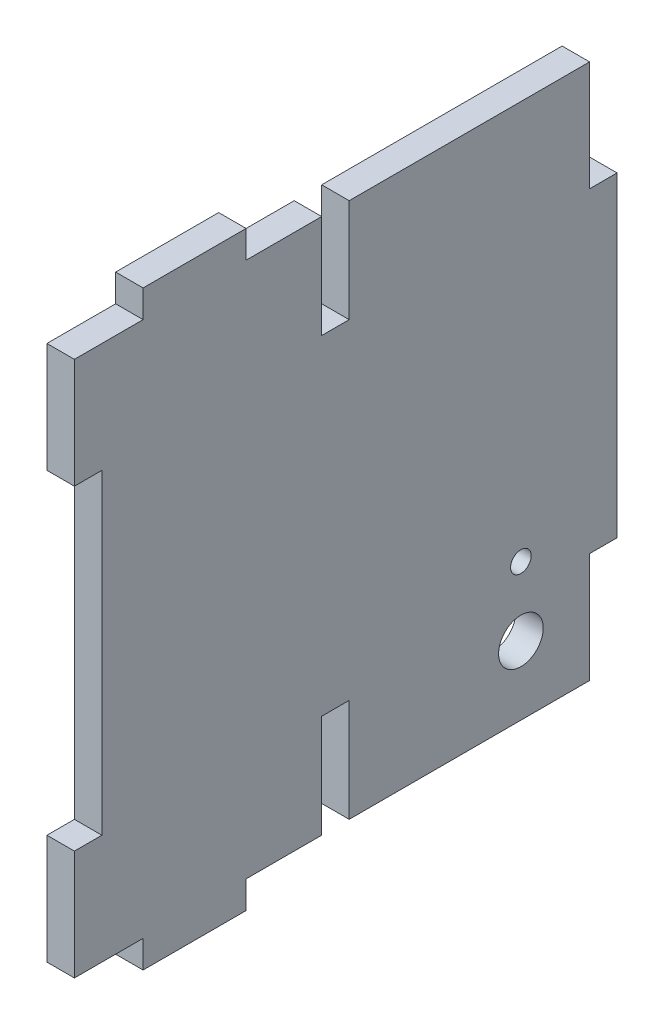
ISO-10303-21;
HEADER;
FILE_DESCRIPTION(('STEP AP214'),'2;1');
FILE_NAME('part.step','',(''),(''),'','','');
FILE_SCHEMA(('AUTOMOTIVE_DESIGN { 1 0 10303 214 1 1 1 1 }'));
ENDSEC;
DATA;
#1=APPLICATION_CONTEXT('core data for automotive mechanical design processes');
#2=APPLICATION_PROTOCOL_DEFINITION('international standard','automotive_design',2000,#1);
#3=PRODUCT_CONTEXT('',#1,'mechanical');
#4=PRODUCT('Part','Part','',(#3));
#5=PRODUCT_RELATED_PRODUCT_CATEGORY('part','',(#4));
#6=PRODUCT_DEFINITION_FORMATION('','',#4);
#7=PRODUCT_DEFINITION_CONTEXT('part definition',#1,'design');
#8=PRODUCT_DEFINITION('design','',#6,#7);
#9=PRODUCT_DEFINITION_SHAPE('','',#8);
#10=(LENGTH_UNIT() NAMED_UNIT(*) SI_UNIT(.MILLI.,.METRE.));
#11=(NAMED_UNIT(*) PLANE_ANGLE_UNIT() SI_UNIT($,.RADIAN.));
#12=(NAMED_UNIT(*) SI_UNIT($,.STERADIAN.) SOLID_ANGLE_UNIT());
#13=UNCERTAINTY_MEASURE_WITH_UNIT(LENGTH_MEASURE(1.E-05),#10,'distance_accuracy_value','');
#14=(GEOMETRIC_REPRESENTATION_CONTEXT(3) GLOBAL_UNCERTAINTY_ASSIGNED_CONTEXT((#13)) GLOBAL_UNIT_ASSIGNED_CONTEXT((#10,
#11,#12)) REPRESENTATION_CONTEXT('',''));
#15=CARTESIAN_POINT('',(0.,0.,0.));
#16=DIRECTION('',(0.,0.,1.));
#17=DIRECTION('',(1.,0.,0.));
#18=AXIS2_PLACEMENT_3D('',#15,#16,#17);
#19=CARTESIAN_POINT('',(4.,0.,0.));
#20=DIRECTION('',(0.,0.,-1.));
#21=DIRECTION('',(-1.,0.,0.));
#22=AXIS2_PLACEMENT_3D('',#19,#20,#21);
#23=PLANE('',#22);
#24=DIRECTION('',(0.,-1.,0.));
#25=VECTOR('',#24,1.);
#26=CARTESIAN_POINT('',(0.,0.,0.));
#27=LINE('',#26,#25);
#28=CARTESIAN_POINT('',(0.,16.,0.));
#29=VERTEX_POINT('',#28);
#30=CARTESIAN_POINT('',(0.,0.,0.));
#31=VERTEX_POINT('',#30);
#32=EDGE_CURVE('E250',#29,#31,#27,.T.);
#33=ORIENTED_EDGE('',*,*,#32,.T.);
#34=DIRECTION('',(-1.,0.,0.));
#35=VECTOR('',#34,1.);
#36=CARTESIAN_POINT('',(4.,0.,0.));
#37=LINE('',#36,#35);
#38=CARTESIAN_POINT('',(4.,0.,0.));
#39=VERTEX_POINT('',#38);
#40=EDGE_CURVE('E11',#39,#31,#37,.T.);
#41=ORIENTED_EDGE('',*,*,#40,.F.);
#42=DIRECTION('',(0.,-1.,0.));
#43=VECTOR('',#42,1.);
#44=CARTESIAN_POINT('',(4.,0.,0.));
#45=LINE('',#44,#43);
#46=CARTESIAN_POINT('',(4.,16.,0.));
#47=VERTEX_POINT('',#46);
#48=EDGE_CURVE('E305',#47,#39,#45,.T.);
#49=ORIENTED_EDGE('',*,*,#48,.F.);
#50=DIRECTION('',(-1.,0.,0.));
#51=VECTOR('',#50,1.);
#52=CARTESIAN_POINT('',(4.,16.,0.));
#53=LINE('',#52,#51);
#54=EDGE_CURVE('E246',#47,#29,#53,.T.);
#55=ORIENTED_EDGE('',*,*,#54,.T.);
#56=EDGE_LOOP('',(#33,#41,#49,#55));
#57=FACE_BOUND('',#56,.T.);
#58=ADVANCED_FACE('F34',(#57),#23,.F.);
#59=CARTESIAN_POINT('',(4.,0.,0.));
#60=DIRECTION('',(0.,1.,0.));
#61=DIRECTION('',(0.,0.,1.));
#62=AXIS2_PLACEMENT_3D('',#59,#60,#61);
#63=PLANE('',#62);
#64=DIRECTION('',(0.,0.,-1.));
#65=VECTOR('',#64,1.);
#66=CARTESIAN_POINT('',(0.,0.,0.));
#67=LINE('',#66,#65);
#68=CARTESIAN_POINT('',(0.,0.,-10.));
#69=VERTEX_POINT('',#68);
#70=EDGE_CURVE('E253',#31,#69,#67,.T.);
#71=ORIENTED_EDGE('',*,*,#70,.T.);
#72=DIRECTION('',(-1.,0.,0.));
#73=VECTOR('',#72,1.);
#74=CARTESIAN_POINT('',(4.,0.,-10.));
#75=LINE('',#74,#73);
#76=CARTESIAN_POINT('',(4.,0.,-10.));
#77=VERTEX_POINT('',#76);
#78=EDGE_CURVE('E42',#77,#69,#75,.T.);
#79=ORIENTED_EDGE('',*,*,#78,.F.);
#80=DIRECTION('',(0.,0.,-1.));
#81=VECTOR('',#80,1.);
#82=CARTESIAN_POINT('',(4.,0.,0.));
#83=LINE('',#82,#81);
#84=EDGE_CURVE('E153',#39,#77,#83,.T.);
#85=ORIENTED_EDGE('',*,*,#84,.F.);
#86=ORIENTED_EDGE('',*,*,#40,.T.);
#87=EDGE_LOOP('',(#71,#79,#85,#86));
#88=FACE_BOUND('',#87,.T.);
#89=ADVANCED_FACE('F464',(#88),#63,.F.);
#90=CARTESIAN_POINT('',(4.,0.,-10.));
#91=DIRECTION('',(0.,0.,-1.));
#92=DIRECTION('',(0.,1.,0.));
#93=AXIS2_PLACEMENT_3D('',#90,#91,#92);
#94=PLANE('',#93);
#95=DIRECTION('',(0.,-1.,0.));
#96=VECTOR('',#95,1.);
#97=CARTESIAN_POINT('',(0.,0.,-10.));
#98=LINE('',#97,#96);
#99=CARTESIAN_POINT('',(0.,-4.,-10.));
#100=VERTEX_POINT('',#99);
#101=EDGE_CURVE('E256',#69,#100,#98,.T.);
#102=ORIENTED_EDGE('',*,*,#101,.T.);
#103=DIRECTION('',(-1.,0.,0.));
#104=VECTOR('',#103,1.);
#105=CARTESIAN_POINT('',(4.,-4.,-10.));
#106=LINE('',#105,#104);
#107=CARTESIAN_POINT('',(4.,-4.,-10.));
#108=VERTEX_POINT('',#107);
#109=EDGE_CURVE('E372',#108,#100,#106,.T.);
#110=ORIENTED_EDGE('',*,*,#109,.F.);
#111=DIRECTION('',(0.,-1.,0.));
#112=VECTOR('',#111,1.);
#113=CARTESIAN_POINT('',(4.,0.,-10.));
#114=LINE('',#113,#112);
#115=EDGE_CURVE('E380',#77,#108,#114,.T.);
#116=ORIENTED_EDGE('',*,*,#115,.F.);
#117=ORIENTED_EDGE('',*,*,#78,.T.);
#118=EDGE_LOOP('',(#102,#110,#116,#117));
#119=FACE_BOUND('',#118,.T.);
#120=ADVANCED_FACE('F378',(#119),#94,.F.);
#121=CARTESIAN_POINT('',(4.,-4.,-10.));
#122=DIRECTION('',(0.,1.,0.));
#123=DIRECTION('',(0.,0.,1.));
#124=AXIS2_PLACEMENT_3D('',#121,#122,#123);
#125=PLANE('',#124);
#126=DIRECTION('',(0.,0.,-1.));
#127=VECTOR('',#126,1.);
#128=CARTESIAN_POINT('',(0.,-4.,-10.));
#129=LINE('',#128,#127);
#130=CARTESIAN_POINT('',(0.,-4.,-25.));
#131=VERTEX_POINT('',#130);
#132=EDGE_CURVE('E258',#100,#131,#129,.T.);
#133=ORIENTED_EDGE('',*,*,#132,.T.);
#134=DIRECTION('',(-1.,0.,0.));
#135=VECTOR('',#134,1.);
#136=CARTESIAN_POINT('',(4.,-4.,-25.));
#137=LINE('',#136,#135);
#138=CARTESIAN_POINT('',(4.,-4.,-25.));
#139=VERTEX_POINT('',#138);
#140=EDGE_CURVE('E369',#139,#131,#137,.T.);
#141=ORIENTED_EDGE('',*,*,#140,.F.);
#142=DIRECTION('',(0.,0.,-1.));
#143=VECTOR('',#142,1.);
#144=CARTESIAN_POINT('',(4.,-4.,-10.));
#145=LINE('',#144,#143);
#146=EDGE_CURVE('E398',#108,#139,#145,.T.);
#147=ORIENTED_EDGE('',*,*,#146,.F.);
#148=ORIENTED_EDGE('',*,*,#109,.T.);
#149=EDGE_LOOP('',(#133,#141,#147,#148));
#150=FACE_BOUND('',#149,.T.);
#151=ADVANCED_FACE('F389',(#150),#125,.F.);
#152=CARTESIAN_POINT('',(4.,-4.,-25.));
#153=DIRECTION('',(0.,0.,1.));
#154=DIRECTION('',(0.,-1.,0.));
#155=AXIS2_PLACEMENT_3D('',#152,#153,#154);
#156=PLANE('',#155);
#157=DIRECTION('',(0.,1.,0.));
#158=VECTOR('',#157,1.);
#159=CARTESIAN_POINT('',(0.,-4.,-25.));
#160=LINE('',#159,#158);
#161=CARTESIAN_POINT('',(0.,0.,-25.));
#162=VERTEX_POINT('',#161);
#163=EDGE_CURVE('E260',#131,#162,#160,.T.);
#164=ORIENTED_EDGE('',*,*,#163,.T.);
#165=DIRECTION('',(-1.,0.,0.));
#166=VECTOR('',#165,1.);
#167=CARTESIAN_POINT('',(4.,0.,-25.));
#168=LINE('',#167,#166);
#169=CARTESIAN_POINT('',(4.,0.,-25.));
#170=VERTEX_POINT('',#169);
#171=EDGE_CURVE('E366',#170,#162,#168,.T.);
#172=ORIENTED_EDGE('',*,*,#171,.F.);
#173=DIRECTION('',(0.,1.,0.));
#174=VECTOR('',#173,1.);
#175=CARTESIAN_POINT('',(4.,-4.,-25.));
#176=LINE('',#175,#174);
#177=EDGE_CURVE('E395',#139,#170,#176,.T.);
#178=ORIENTED_EDGE('',*,*,#177,.F.);
#179=ORIENTED_EDGE('',*,*,#140,.T.);
#180=EDGE_LOOP('',(#164,#172,#178,#179));
#181=FACE_BOUND('',#180,.T.);
#182=ADVANCED_FACE('F393',(#181),#156,.F.);
#183=CARTESIAN_POINT('',(4.,0.,-25.));
#184=DIRECTION('',(0.,1.,0.));
#185=DIRECTION('',(0.,0.,1.));
#186=AXIS2_PLACEMENT_3D('',#183,#184,#185);
#187=PLANE('',#186);
#188=DIRECTION('',(0.,0.,-1.));
#189=VECTOR('',#188,1.);
#190=CARTESIAN_POINT('',(0.,0.,-25.));
#191=LINE('',#190,#189);
#192=CARTESIAN_POINT('',(0.,0.,-36.));
#193=VERTEX_POINT('',#192);
#194=EDGE_CURVE('E262',#162,#193,#191,.T.);
#195=ORIENTED_EDGE('',*,*,#194,.T.);
#196=DIRECTION('',(-1.,0.,0.));
#197=VECTOR('',#196,1.);
#198=CARTESIAN_POINT('',(4.,0.,-36.));
#199=LINE('',#198,#197);
#200=CARTESIAN_POINT('',(4.,0.,-36.));
#201=VERTEX_POINT('',#200);
#202=EDGE_CURVE('E363',#201,#193,#199,.T.);
#203=ORIENTED_EDGE('',*,*,#202,.F.);
#204=DIRECTION('',(0.,0.,-1.));
#205=VECTOR('',#204,1.);
#206=CARTESIAN_POINT('',(4.,0.,-25.));
#207=LINE('',#206,#205);
#208=EDGE_CURVE('E397',#170,#201,#207,.T.);
#209=ORIENTED_EDGE('',*,*,#208,.F.);
#210=ORIENTED_EDGE('',*,*,#171,.T.);
#211=EDGE_LOOP('',(#195,#203,#209,#210));
#212=FACE_BOUND('',#211,.T.);
#213=ADVANCED_FACE('F477',(#212),#187,.F.);
#214=CARTESIAN_POINT('',(4.,0.,-36.));
#215=DIRECTION('',(0.,0.,1.));
#216=DIRECTION('',(1.,0.,0.));
#217=AXIS2_PLACEMENT_3D('',#214,#215,#216);
#218=PLANE('',#217);
#219=DIRECTION('',(0.,1.,0.));
#220=VECTOR('',#219,1.);
#221=CARTESIAN_POINT('',(0.,0.,-36.));
#222=LINE('',#221,#220);
#223=CARTESIAN_POINT('',(0.,15.,-36.));
#224=VERTEX_POINT('',#223);
#225=EDGE_CURVE('E264',#193,#224,#222,.T.);
#226=ORIENTED_EDGE('',*,*,#225,.T.);
#227=DIRECTION('',(-1.,0.,0.));
#228=VECTOR('',#227,1.);
#229=CARTESIAN_POINT('',(4.,15.,-36.));
#230=LINE('',#229,#228);
#231=CARTESIAN_POINT('',(4.,15.,-36.));
#232=VERTEX_POINT('',#231);
#233=EDGE_CURVE('E360',#232,#224,#230,.T.);
#234=ORIENTED_EDGE('',*,*,#233,.F.);
#235=DIRECTION('',(0.,1.,0.));
#236=VECTOR('',#235,1.);
#237=CARTESIAN_POINT('',(4.,0.,-36.));
#238=LINE('',#237,#236);
#239=EDGE_CURVE('E400',#201,#232,#238,.T.);
#240=ORIENTED_EDGE('',*,*,#239,.F.);
#241=ORIENTED_EDGE('',*,*,#202,.T.);
#242=EDGE_LOOP('',(#226,#234,#240,#241));
#243=FACE_BOUND('',#242,.T.);
#244=ADVANCED_FACE('F480',(#243),#218,.F.);
#245=CARTESIAN_POINT('',(4.,15.,-36.));
#246=DIRECTION('',(0.,1.,0.));
#247=DIRECTION('',(0.,0.,1.));
#248=AXIS2_PLACEMENT_3D('',#245,#246,#247);
#249=PLANE('',#248);
#250=DIRECTION('',(0.,0.,-1.));
#251=VECTOR('',#250,1.);
#252=CARTESIAN_POINT('',(0.,15.,-36.));
#253=LINE('',#252,#251);
#254=CARTESIAN_POINT('',(0.,15.,-40.));
#255=VERTEX_POINT('',#254);
#256=EDGE_CURVE('E266',#224,#255,#253,.T.);
#257=ORIENTED_EDGE('',*,*,#256,.T.);
#258=DIRECTION('',(-1.,0.,0.));
#259=VECTOR('',#258,1.);
#260=CARTESIAN_POINT('',(4.,15.,-40.));
#261=LINE('',#260,#259);
#262=CARTESIAN_POINT('',(4.,15.,-40.));
#263=VERTEX_POINT('',#262);
#264=EDGE_CURVE('E357',#263,#255,#261,.T.);
#265=ORIENTED_EDGE('',*,*,#264,.F.);
#266=DIRECTION('',(0.,0.,-1.));
#267=VECTOR('',#266,1.);
#268=CARTESIAN_POINT('',(4.,15.,-36.));
#269=LINE('',#268,#267);
#270=EDGE_CURVE('E406',#232,#263,#269,.T.);
#271=ORIENTED_EDGE('',*,*,#270,.F.);
#272=ORIENTED_EDGE('',*,*,#233,.T.);
#273=EDGE_LOOP('',(#257,#265,#271,#272));
#274=FACE_BOUND('',#273,.T.);
#275=ADVANCED_FACE('F484',(#274),#249,.F.);
#276=CARTESIAN_POINT('',(4.,0.,-40.));
#277=DIRECTION('',(0.,0.,-1.));
#278=DIRECTION('',(-1.,0.,0.));
#279=AXIS2_PLACEMENT_3D('',#276,#277,#278);
#280=PLANE('',#279);
#281=DIRECTION('',(0.,-1.,0.));
#282=VECTOR('',#281,1.);
#283=CARTESIAN_POINT('',(0.,0.,-40.));
#284=LINE('',#283,#282);
#285=CARTESIAN_POINT('',(0.,0.,-40.));
#286=VERTEX_POINT('',#285);
#287=EDGE_CURVE('E268',#255,#286,#284,.T.);
#288=ORIENTED_EDGE('',*,*,#287,.T.);
#289=DIRECTION('',(-1.,0.,0.));
#290=VECTOR('',#289,1.);
#291=CARTESIAN_POINT('',(4.,0.,-40.));
#292=LINE('',#291,#290);
#293=CARTESIAN_POINT('',(4.,0.,-40.));
#294=VERTEX_POINT('',#293);
#295=EDGE_CURVE('E354',#294,#286,#292,.T.);
#296=ORIENTED_EDGE('',*,*,#295,.F.);
#297=DIRECTION('',(0.,-1.,0.));
#298=VECTOR('',#297,1.);
#299=CARTESIAN_POINT('',(4.,0.,-40.));
#300=LINE('',#299,#298);
#301=EDGE_CURVE('E408',#263,#294,#300,.T.);
#302=ORIENTED_EDGE('',*,*,#301,.F.);
#303=ORIENTED_EDGE('',*,*,#264,.T.);
#304=EDGE_LOOP('',(#288,#296,#302,#303));
#305=FACE_BOUND('',#304,.T.);
#306=ADVANCED_FACE('F488',(#305),#280,.F.);
#307=CARTESIAN_POINT('',(4.,0.,-40.));
#308=DIRECTION('',(0.,1.,0.));
#309=DIRECTION('',(0.,0.,1.));
#310=AXIS2_PLACEMENT_3D('',#307,#308,#309);
#311=PLANE('',#310);
#312=DIRECTION('',(0.,0.,-1.));
#313=VECTOR('',#312,1.);
#314=CARTESIAN_POINT('',(0.,0.,-40.));
#315=LINE('',#314,#313);
#316=CARTESIAN_POINT('',(0.,0.,-75.));
#317=VERTEX_POINT('',#316);
#318=EDGE_CURVE('E270',#286,#317,#315,.T.);
#319=ORIENTED_EDGE('',*,*,#318,.T.);
#320=DIRECTION('',(-1.,0.,0.));
#321=VECTOR('',#320,1.);
#322=CARTESIAN_POINT('',(4.,0.,-75.));
#323=LINE('',#322,#321);
#324=CARTESIAN_POINT('',(4.,0.,-75.));
#325=VERTEX_POINT('',#324);
#326=EDGE_CURVE('E351',#325,#317,#323,.T.);
#327=ORIENTED_EDGE('',*,*,#326,.F.);
#328=DIRECTION('',(0.,0.,-1.));
#329=VECTOR('',#328,1.);
#330=CARTESIAN_POINT('',(4.,0.,-40.));
#331=LINE('',#330,#329);
#332=EDGE_CURVE('E410',#294,#325,#331,.T.);
#333=ORIENTED_EDGE('',*,*,#332,.F.);
#334=ORIENTED_EDGE('',*,*,#295,.T.);
#335=EDGE_LOOP('',(#319,#327,#333,#334));
#336=FACE_BOUND('',#335,.T.);
#337=ADVANCED_FACE('F492',(#336),#311,.F.);
#338=CARTESIAN_POINT('',(4.,0.,-75.));
#339=DIRECTION('',(0.,0.,1.));
#340=DIRECTION('',(1.,0.,0.));
#341=AXIS2_PLACEMENT_3D('',#338,#339,#340);
#342=PLANE('',#341);
#343=DIRECTION('',(0.,1.,0.));
#344=VECTOR('',#343,1.);
#345=CARTESIAN_POINT('',(0.,0.,-75.));
#346=LINE('',#345,#344);
#347=CARTESIAN_POINT('',(0.,16.,-75.));
#348=VERTEX_POINT('',#347);
#349=EDGE_CURVE('E272',#317,#348,#346,.T.);
#350=ORIENTED_EDGE('',*,*,#349,.T.);
#351=DIRECTION('',(-1.,0.,0.));
#352=VECTOR('',#351,1.);
#353=CARTESIAN_POINT('',(4.,16.,-75.));
#354=LINE('',#353,#352);
#355=CARTESIAN_POINT('',(4.,16.,-75.));
#356=VERTEX_POINT('',#355);
#357=EDGE_CURVE('E348',#356,#348,#354,.T.);
#358=ORIENTED_EDGE('',*,*,#357,.F.);
#359=DIRECTION('',(0.,1.,0.));
#360=VECTOR('',#359,1.);
#361=CARTESIAN_POINT('',(4.,0.,-75.));
#362=LINE('',#361,#360);
#363=EDGE_CURVE('E412',#325,#356,#362,.T.);
#364=ORIENTED_EDGE('',*,*,#363,.F.);
#365=ORIENTED_EDGE('',*,*,#326,.T.);
#366=EDGE_LOOP('',(#350,#358,#364,#365));
#367=FACE_BOUND('',#366,.T.);
#368=ADVANCED_FACE('F496',(#367),#342,.F.);
#369=CARTESIAN_POINT('',(4.,16.,-75.));
#370=DIRECTION('',(0.,1.,0.));
#371=DIRECTION('',(0.,0.,1.));
#372=AXIS2_PLACEMENT_3D('',#369,#370,#371);
#373=PLANE('',#372);
#374=DIRECTION('',(0.,0.,-1.));
#375=VECTOR('',#374,1.);
#376=CARTESIAN_POINT('',(0.,16.,-75.));
#377=LINE('',#376,#375);
#378=CARTESIAN_POINT('',(0.,16.,-79.));
#379=VERTEX_POINT('',#378);
#380=EDGE_CURVE('E274',#348,#379,#377,.T.);
#381=ORIENTED_EDGE('',*,*,#380,.T.);
#382=DIRECTION('',(-1.,0.,0.));
#383=VECTOR('',#382,1.);
#384=CARTESIAN_POINT('',(4.,16.,-79.));
#385=LINE('',#384,#383);
#386=CARTESIAN_POINT('',(4.,16.,-79.));
#387=VERTEX_POINT('',#386);
#388=EDGE_CURVE('E345',#387,#379,#385,.T.);
#389=ORIENTED_EDGE('',*,*,#388,.F.);
#390=DIRECTION('',(0.,0.,-1.));
#391=VECTOR('',#390,1.);
#392=CARTESIAN_POINT('',(4.,16.,-75.));
#393=LINE('',#392,#391);
#394=EDGE_CURVE('E414',#356,#387,#393,.T.);
#395=ORIENTED_EDGE('',*,*,#394,.F.);
#396=ORIENTED_EDGE('',*,*,#357,.T.);
#397=EDGE_LOOP('',(#381,#389,#395,#396));
#398=FACE_BOUND('',#397,.T.);
#399=ADVANCED_FACE('F500',(#398),#373,.F.);
#400=CARTESIAN_POINT('',(4.,62.,-79.));
#401=DIRECTION('',(0.,0.,1.));
#402=DIRECTION('',(0.,-1.,0.));
#403=AXIS2_PLACEMENT_3D('',#400,#401,#402);
#404=PLANE('',#403);
#405=DIRECTION('',(0.,1.,0.));
#406=VECTOR('',#405,1.);
#407=CARTESIAN_POINT('',(0.,62.,-79.));
#408=LINE('',#407,#406);
#409=CARTESIAN_POINT('',(0.,62.,-79.));
#410=VERTEX_POINT('',#409);
#411=EDGE_CURVE('E276',#379,#410,#408,.T.);
#412=ORIENTED_EDGE('',*,*,#411,.T.);
#413=DIRECTION('',(-1.,0.,0.));
#414=VECTOR('',#413,1.);
#415=CARTESIAN_POINT('',(4.,62.,-79.));
#416=LINE('',#415,#414);
#417=CARTESIAN_POINT('',(4.,62.,-79.));
#418=VERTEX_POINT('',#417);
#419=EDGE_CURVE('E342',#418,#410,#416,.T.);
#420=ORIENTED_EDGE('',*,*,#419,.F.);
#421=DIRECTION('',(0.,1.,0.));
#422=VECTOR('',#421,1.);
#423=CARTESIAN_POINT('',(4.,62.,-79.));
#424=LINE('',#423,#422);
#425=EDGE_CURVE('E416',#387,#418,#424,.T.);
#426=ORIENTED_EDGE('',*,*,#425,.F.);
#427=ORIENTED_EDGE('',*,*,#388,.T.);
#428=EDGE_LOOP('',(#412,#420,#426,#427));
#429=FACE_BOUND('',#428,.T.);
#430=ADVANCED_FACE('F504',(#429),#404,.F.);
#431=CARTESIAN_POINT('',(4.,62.,-75.));
#432=DIRECTION('',(0.,-1.,0.));
#433=DIRECTION('',(0.,0.,-1.));
#434=AXIS2_PLACEMENT_3D('',#431,#432,#433);
#435=PLANE('',#434);
#436=DIRECTION('',(0.,0.,1.));
#437=VECTOR('',#436,1.);
#438=CARTESIAN_POINT('',(0.,62.,-75.));
#439=LINE('',#438,#437);
#440=CARTESIAN_POINT('',(0.,62.,-75.));
#441=VERTEX_POINT('',#440);
#442=EDGE_CURVE('E278',#410,#441,#439,.T.);
#443=ORIENTED_EDGE('',*,*,#442,.T.);
#444=DIRECTION('',(-1.,0.,0.));
#445=VECTOR('',#444,1.);
#446=CARTESIAN_POINT('',(4.,62.,-75.));
#447=LINE('',#446,#445);
#448=CARTESIAN_POINT('',(4.,62.,-75.));
#449=VERTEX_POINT('',#448);
#450=EDGE_CURVE('E339',#449,#441,#447,.T.);
#451=ORIENTED_EDGE('',*,*,#450,.F.);
#452=DIRECTION('',(0.,0.,1.));
#453=VECTOR('',#452,1.);
#454=CARTESIAN_POINT('',(4.,62.,-75.));
#455=LINE('',#454,#453);
#456=EDGE_CURVE('E418',#418,#449,#455,.T.);
#457=ORIENTED_EDGE('',*,*,#456,.F.);
#458=ORIENTED_EDGE('',*,*,#419,.T.);
#459=EDGE_LOOP('',(#443,#451,#457,#458));
#460=FACE_BOUND('',#459,.T.);
#461=ADVANCED_FACE('F508',(#460),#435,.F.);
#462=CARTESIAN_POINT('',(4.,62.,-75.));
#463=DIRECTION('',(0.,0.,1.));
#464=DIRECTION('',(0.,-1.,0.));
#465=AXIS2_PLACEMENT_3D('',#462,#463,#464);
#466=PLANE('',#465);
#467=DIRECTION('',(0.,1.,0.));
#468=VECTOR('',#467,1.);
#469=CARTESIAN_POINT('',(0.,62.,-75.));
#470=LINE('',#469,#468);
#471=CARTESIAN_POINT('',(0.,78.,-75.));
#472=VERTEX_POINT('',#471);
#473=EDGE_CURVE('E280',#441,#472,#470,.T.);
#474=ORIENTED_EDGE('',*,*,#473,.T.);
#475=DIRECTION('',(-1.,0.,0.));
#476=VECTOR('',#475,1.);
#477=CARTESIAN_POINT('',(4.,78.,-75.));
#478=LINE('',#477,#476);
#479=CARTESIAN_POINT('',(4.,78.,-75.));
#480=VERTEX_POINT('',#479);
#481=EDGE_CURVE('E336',#480,#472,#478,.T.);
#482=ORIENTED_EDGE('',*,*,#481,.F.);
#483=DIRECTION('',(0.,1.,0.));
#484=VECTOR('',#483,1.);
#485=CARTESIAN_POINT('',(4.,62.,-75.));
#486=LINE('',#485,#484);
#487=EDGE_CURVE('E420',#449,#480,#486,.T.);
#488=ORIENTED_EDGE('',*,*,#487,.F.);
#489=ORIENTED_EDGE('',*,*,#450,.T.);
#490=EDGE_LOOP('',(#474,#482,#488,#489));
#491=FACE_BOUND('',#490,.T.);
#492=ADVANCED_FACE('F512',(#491),#466,.F.);
#493=CARTESIAN_POINT('',(4.,78.,-40.));
#494=DIRECTION('',(0.,-1.,0.));
#495=DIRECTION('',(0.,0.,-1.));
#496=AXIS2_PLACEMENT_3D('',#493,#494,#495);
#497=PLANE('',#496);
#498=DIRECTION('',(0.,0.,1.));
#499=VECTOR('',#498,1.);
#500=CARTESIAN_POINT('',(0.,78.,-40.));
#501=LINE('',#500,#499);
#502=CARTESIAN_POINT('',(0.,78.,-40.));
#503=VERTEX_POINT('',#502);
#504=EDGE_CURVE('E282',#472,#503,#501,.T.);
#505=ORIENTED_EDGE('',*,*,#504,.T.);
#506=DIRECTION('',(-1.,0.,0.));
#507=VECTOR('',#506,1.);
#508=CARTESIAN_POINT('',(4.,78.,-40.));
#509=LINE('',#508,#507);
#510=CARTESIAN_POINT('',(4.,78.,-40.));
#511=VERTEX_POINT('',#510);
#512=EDGE_CURVE('E333',#511,#503,#509,.T.);
#513=ORIENTED_EDGE('',*,*,#512,.F.);
#514=DIRECTION('',(0.,0.,1.));
#515=VECTOR('',#514,1.);
#516=CARTESIAN_POINT('',(4.,78.,-40.));
#517=LINE('',#516,#515);
#518=EDGE_CURVE('E422',#480,#511,#517,.T.);
#519=ORIENTED_EDGE('',*,*,#518,.F.);
#520=ORIENTED_EDGE('',*,*,#481,.T.);
#521=EDGE_LOOP('',(#505,#513,#519,#520));
#522=FACE_BOUND('',#521,.T.);
#523=ADVANCED_FACE('F516',(#522),#497,.F.);
#524=CARTESIAN_POINT('',(4.,78.,-40.));
#525=DIRECTION('',(0.,0.,-1.));
#526=DIRECTION('',(0.,1.,0.));
#527=AXIS2_PLACEMENT_3D('',#524,#525,#526);
#528=PLANE('',#527);
#529=DIRECTION('',(0.,-1.,0.));
#530=VECTOR('',#529,1.);
#531=CARTESIAN_POINT('',(0.,78.,-40.));
#532=LINE('',#531,#530);
#533=CARTESIAN_POINT('',(0.,63.,-40.));
#534=VERTEX_POINT('',#533);
#535=EDGE_CURVE('E284',#503,#534,#532,.T.);
#536=ORIENTED_EDGE('',*,*,#535,.T.);
#537=DIRECTION('',(-1.,0.,0.));
#538=VECTOR('',#537,1.);
#539=CARTESIAN_POINT('',(4.,63.,-40.));
#540=LINE('',#539,#538);
#541=CARTESIAN_POINT('',(4.,63.,-40.));
#542=VERTEX_POINT('',#541);
#543=EDGE_CURVE('E330',#542,#534,#540,.T.);
#544=ORIENTED_EDGE('',*,*,#543,.F.);
#545=DIRECTION('',(0.,-1.,0.));
#546=VECTOR('',#545,1.);
#547=CARTESIAN_POINT('',(4.,78.,-40.));
#548=LINE('',#547,#546);
#549=EDGE_CURVE('E424',#511,#542,#548,.T.);
#550=ORIENTED_EDGE('',*,*,#549,.F.);
#551=ORIENTED_EDGE('',*,*,#512,.T.);
#552=EDGE_LOOP('',(#536,#544,#550,#551));
#553=FACE_BOUND('',#552,.T.);
#554=ADVANCED_FACE('F520',(#553),#528,.F.);
#555=CARTESIAN_POINT('',(4.,63.,-36.));
#556=DIRECTION('',(0.,-1.,0.));
#557=DIRECTION('',(0.,0.,-1.));
#558=AXIS2_PLACEMENT_3D('',#555,#556,#557);
#559=PLANE('',#558);
#560=DIRECTION('',(0.,0.,1.));
#561=VECTOR('',#560,1.);
#562=CARTESIAN_POINT('',(0.,63.,-36.));
#563=LINE('',#562,#561);
#564=CARTESIAN_POINT('',(0.,63.,-36.));
#565=VERTEX_POINT('',#564);
#566=EDGE_CURVE('E286',#534,#565,#563,.T.);
#567=ORIENTED_EDGE('',*,*,#566,.T.);
#568=DIRECTION('',(-1.,0.,0.));
#569=VECTOR('',#568,1.);
#570=CARTESIAN_POINT('',(4.,63.,-36.));
#571=LINE('',#570,#569);
#572=CARTESIAN_POINT('',(4.,63.,-36.));
#573=VERTEX_POINT('',#572);
#574=EDGE_CURVE('E327',#573,#565,#571,.T.);
#575=ORIENTED_EDGE('',*,*,#574,.F.);
#576=DIRECTION('',(0.,0.,1.));
#577=VECTOR('',#576,1.);
#578=CARTESIAN_POINT('',(4.,63.,-36.));
#579=LINE('',#578,#577);
#580=EDGE_CURVE('E426',#542,#573,#579,.T.);
#581=ORIENTED_EDGE('',*,*,#580,.F.);
#582=ORIENTED_EDGE('',*,*,#543,.T.);
#583=EDGE_LOOP('',(#567,#575,#581,#582));
#584=FACE_BOUND('',#583,.T.);
#585=ADVANCED_FACE('F524',(#584),#559,.F.);
#586=CARTESIAN_POINT('',(4.,78.,-36.));
#587=DIRECTION('',(0.,0.,1.));
#588=DIRECTION('',(1.,0.,0.));
#589=AXIS2_PLACEMENT_3D('',#586,#587,#588);
#590=PLANE('',#589);
#591=DIRECTION('',(0.,1.,0.));
#592=VECTOR('',#591,1.);
#593=CARTESIAN_POINT('',(0.,78.,-36.));
#594=LINE('',#593,#592);
#595=CARTESIAN_POINT('',(0.,78.,-36.));
#596=VERTEX_POINT('',#595);
#597=EDGE_CURVE('E288',#565,#596,#594,.T.);
#598=ORIENTED_EDGE('',*,*,#597,.T.);
#599=DIRECTION('',(-1.,0.,0.));
#600=VECTOR('',#599,1.);
#601=CARTESIAN_POINT('',(4.,78.,-36.));
#602=LINE('',#601,#600);
#603=CARTESIAN_POINT('',(4.,78.,-36.));
#604=VERTEX_POINT('',#603);
#605=EDGE_CURVE('E324',#604,#596,#602,.T.);
#606=ORIENTED_EDGE('',*,*,#605,.F.);
#607=DIRECTION('',(0.,1.,0.));
#608=VECTOR('',#607,1.);
#609=CARTESIAN_POINT('',(4.,78.,-36.));
#610=LINE('',#609,#608);
#611=EDGE_CURVE('E428',#573,#604,#610,.T.);
#612=ORIENTED_EDGE('',*,*,#611,.F.);
#613=ORIENTED_EDGE('',*,*,#574,.T.);
#614=EDGE_LOOP('',(#598,#606,#612,#613));
#615=FACE_BOUND('',#614,.T.);
#616=ADVANCED_FACE('F528',(#615),#590,.F.);
#617=CARTESIAN_POINT('',(4.,78.,-25.));
#618=DIRECTION('',(0.,-1.,0.));
#619=DIRECTION('',(0.,0.,-1.));
#620=AXIS2_PLACEMENT_3D('',#617,#618,#619);
#621=PLANE('',#620);
#622=DIRECTION('',(0.,0.,1.));
#623=VECTOR('',#622,1.);
#624=CARTESIAN_POINT('',(0.,78.,-25.));
#625=LINE('',#624,#623);
#626=CARTESIAN_POINT('',(0.,78.,-25.));
#627=VERTEX_POINT('',#626);
#628=EDGE_CURVE('E290',#596,#627,#625,.T.);
#629=ORIENTED_EDGE('',*,*,#628,.T.);
#630=DIRECTION('',(-1.,0.,0.));
#631=VECTOR('',#630,1.);
#632=CARTESIAN_POINT('',(4.,78.,-25.));
#633=LINE('',#632,#631);
#634=CARTESIAN_POINT('',(4.,78.,-25.));
#635=VERTEX_POINT('',#634);
#636=EDGE_CURVE('E321',#635,#627,#633,.T.);
#637=ORIENTED_EDGE('',*,*,#636,.F.);
#638=DIRECTION('',(0.,0.,1.));
#639=VECTOR('',#638,1.);
#640=CARTESIAN_POINT('',(4.,78.,-25.));
#641=LINE('',#640,#639);
#642=EDGE_CURVE('E430',#604,#635,#641,.T.);
#643=ORIENTED_EDGE('',*,*,#642,.F.);
#644=ORIENTED_EDGE('',*,*,#605,.T.);
#645=EDGE_LOOP('',(#629,#637,#643,#644));
#646=FACE_BOUND('',#645,.T.);
#647=ADVANCED_FACE('F532',(#646),#621,.F.);
#648=CARTESIAN_POINT('',(4.,82.,-25.));
#649=DIRECTION('',(0.,0.,1.));
#650=DIRECTION('',(0.,-1.,0.));
#651=AXIS2_PLACEMENT_3D('',#648,#649,#650);
#652=PLANE('',#651);
#653=DIRECTION('',(0.,1.,0.));
#654=VECTOR('',#653,1.);
#655=CARTESIAN_POINT('',(0.,82.,-25.));
#656=LINE('',#655,#654);
#657=CARTESIAN_POINT('',(0.,82.,-25.));
#658=VERTEX_POINT('',#657);
#659=EDGE_CURVE('E292',#627,#658,#656,.T.);
#660=ORIENTED_EDGE('',*,*,#659,.T.);
#661=DIRECTION('',(-1.,0.,0.));
#662=VECTOR('',#661,1.);
#663=CARTESIAN_POINT('',(4.,82.,-25.));
#664=LINE('',#663,#662);
#665=CARTESIAN_POINT('',(4.,82.,-25.));
#666=VERTEX_POINT('',#665);
#667=EDGE_CURVE('E318',#666,#658,#664,.T.);
#668=ORIENTED_EDGE('',*,*,#667,.F.);
#669=DIRECTION('',(0.,1.,0.));
#670=VECTOR('',#669,1.);
#671=CARTESIAN_POINT('',(4.,82.,-25.));
#672=LINE('',#671,#670);
#673=EDGE_CURVE('E432',#635,#666,#672,.T.);
#674=ORIENTED_EDGE('',*,*,#673,.F.);
#675=ORIENTED_EDGE('',*,*,#636,.T.);
#676=EDGE_LOOP('',(#660,#668,#674,#675));
#677=FACE_BOUND('',#676,.T.);
#678=ADVANCED_FACE('F536',(#677),#652,.F.);
#679=CARTESIAN_POINT('',(4.,82.,-10.));
#680=DIRECTION('',(0.,-1.,0.));
#681=DIRECTION('',(0.,0.,-1.));
#682=AXIS2_PLACEMENT_3D('',#679,#680,#681);
#683=PLANE('',#682);
#684=DIRECTION('',(0.,0.,1.));
#685=VECTOR('',#684,1.);
#686=CARTESIAN_POINT('',(0.,82.,-10.));
#687=LINE('',#686,#685);
#688=CARTESIAN_POINT('',(0.,82.,-10.));
#689=VERTEX_POINT('',#688);
#690=EDGE_CURVE('E294',#658,#689,#687,.T.);
#691=ORIENTED_EDGE('',*,*,#690,.T.);
#692=DIRECTION('',(-1.,0.,0.));
#693=VECTOR('',#692,1.);
#694=CARTESIAN_POINT('',(4.,82.,-10.));
#695=LINE('',#694,#693);
#696=CARTESIAN_POINT('',(4.,82.,-10.));
#697=VERTEX_POINT('',#696);
#698=EDGE_CURVE('E315',#697,#689,#695,.T.);
#699=ORIENTED_EDGE('',*,*,#698,.F.);
#700=DIRECTION('',(0.,0.,1.));
#701=VECTOR('',#700,1.);
#702=CARTESIAN_POINT('',(4.,82.,-10.));
#703=LINE('',#702,#701);
#704=EDGE_CURVE('E434',#666,#697,#703,.T.);
#705=ORIENTED_EDGE('',*,*,#704,.F.);
#706=ORIENTED_EDGE('',*,*,#667,.T.);
#707=EDGE_LOOP('',(#691,#699,#705,#706));
#708=FACE_BOUND('',#707,.T.);
#709=ADVANCED_FACE('F540',(#708),#683,.F.);
#710=CARTESIAN_POINT('',(4.,78.,-10.));
#711=DIRECTION('',(0.,0.,-1.));
#712=DIRECTION('',(0.,1.,0.));
#713=AXIS2_PLACEMENT_3D('',#710,#711,#712);
#714=PLANE('',#713);
#715=DIRECTION('',(0.,-1.,0.));
#716=VECTOR('',#715,1.);
#717=CARTESIAN_POINT('',(0.,78.,-10.));
#718=LINE('',#717,#716);
#719=CARTESIAN_POINT('',(0.,78.,-10.));
#720=VERTEX_POINT('',#719);
#721=EDGE_CURVE('E296',#689,#720,#718,.T.);
#722=ORIENTED_EDGE('',*,*,#721,.T.);
#723=DIRECTION('',(-1.,0.,0.));
#724=VECTOR('',#723,1.);
#725=CARTESIAN_POINT('',(4.,78.,-10.));
#726=LINE('',#725,#724);
#727=CARTESIAN_POINT('',(4.,78.,-10.));
#728=VERTEX_POINT('',#727);
#729=EDGE_CURVE('E312',#728,#720,#726,.T.);
#730=ORIENTED_EDGE('',*,*,#729,.F.);
#731=DIRECTION('',(0.,-1.,0.));
#732=VECTOR('',#731,1.);
#733=CARTESIAN_POINT('',(4.,78.,-10.));
#734=LINE('',#733,#732);
#735=EDGE_CURVE('E436',#697,#728,#734,.T.);
#736=ORIENTED_EDGE('',*,*,#735,.F.);
#737=ORIENTED_EDGE('',*,*,#698,.T.);
#738=EDGE_LOOP('',(#722,#730,#736,#737));
#739=FACE_BOUND('',#738,.T.);
#740=ADVANCED_FACE('F544',(#739),#714,.F.);
#741=CARTESIAN_POINT('',(4.,78.,0.));
#742=DIRECTION('',(0.,-1.,0.));
#743=DIRECTION('',(0.,0.,-1.));
#744=AXIS2_PLACEMENT_3D('',#741,#742,#743);
#745=PLANE('',#744);
#746=DIRECTION('',(0.,0.,1.));
#747=VECTOR('',#746,1.);
#748=CARTESIAN_POINT('',(0.,78.,0.));
#749=LINE('',#748,#747);
#750=CARTESIAN_POINT('',(0.,78.,0.));
#751=VERTEX_POINT('',#750);
#752=EDGE_CURVE('E298',#720,#751,#749,.T.);
#753=ORIENTED_EDGE('',*,*,#752,.T.);
#754=DIRECTION('',(-1.,0.,0.));
#755=VECTOR('',#754,1.);
#756=CARTESIAN_POINT('',(4.,78.,0.));
#757=LINE('',#756,#755);
#758=CARTESIAN_POINT('',(4.,78.,0.));
#759=VERTEX_POINT('',#758);
#760=EDGE_CURVE('E309',#759,#751,#757,.T.);
#761=ORIENTED_EDGE('',*,*,#760,.F.);
#762=DIRECTION('',(0.,0.,1.));
#763=VECTOR('',#762,1.);
#764=CARTESIAN_POINT('',(4.,78.,0.));
#765=LINE('',#764,#763);
#766=EDGE_CURVE('E438',#728,#759,#765,.T.);
#767=ORIENTED_EDGE('',*,*,#766,.F.);
#768=ORIENTED_EDGE('',*,*,#729,.T.);
#769=EDGE_LOOP('',(#753,#761,#767,#768));
#770=FACE_BOUND('',#769,.T.);
#771=ADVANCED_FACE('F444',(#770),#745,.F.);
#772=CARTESIAN_POINT('',(4.,62.,0.));
#773=DIRECTION('',(0.,0.,-1.));
#774=DIRECTION('',(-1.,0.,0.));
#775=AXIS2_PLACEMENT_3D('',#772,#773,#774);
#776=PLANE('',#775);
#777=DIRECTION('',(0.,-1.,0.));
#778=VECTOR('',#777,1.);
#779=CARTESIAN_POINT('',(0.,62.,0.));
#780=LINE('',#779,#778);
#781=CARTESIAN_POINT('',(0.,62.,0.));
#782=VERTEX_POINT('',#781);
#783=EDGE_CURVE('E300',#751,#782,#780,.T.);
#784=ORIENTED_EDGE('',*,*,#783,.T.);
#785=DIRECTION('',(-1.,0.,0.));
#786=VECTOR('',#785,1.);
#787=CARTESIAN_POINT('',(4.,62.,0.));
#788=LINE('',#787,#786);
#789=CARTESIAN_POINT('',(4.,62.,0.));
#790=VERTEX_POINT('',#789);
#791=EDGE_CURVE('E241',#790,#782,#788,.T.);
#792=ORIENTED_EDGE('',*,*,#791,.F.);
#793=DIRECTION('',(0.,-1.,0.));
#794=VECTOR('',#793,1.);
#795=CARTESIAN_POINT('',(4.,62.,0.));
#796=LINE('',#795,#794);
#797=EDGE_CURVE('E232',#759,#790,#796,.T.);
#798=ORIENTED_EDGE('',*,*,#797,.F.);
#799=ORIENTED_EDGE('',*,*,#760,.T.);
#800=EDGE_LOOP('',(#784,#792,#798,#799));
#801=FACE_BOUND('',#800,.T.);
#802=ADVANCED_FACE('F448',(#801),#776,.F.);
#803=CARTESIAN_POINT('',(4.,62.,0.));
#804=DIRECTION('',(0.,1.,0.));
#805=DIRECTION('',(0.,0.,1.));
#806=AXIS2_PLACEMENT_3D('',#803,#804,#805);
#807=PLANE('',#806);
#808=DIRECTION('',(0.,0.,-1.));
#809=VECTOR('',#808,1.);
#810=CARTESIAN_POINT('',(0.,62.,0.));
#811=LINE('',#810,#809);
#812=CARTESIAN_POINT('',(0.,62.,-4.));
#813=VERTEX_POINT('',#812);
#814=EDGE_CURVE('E240',#782,#813,#811,.T.);
#815=ORIENTED_EDGE('',*,*,#814,.T.);
#816=DIRECTION('',(-1.,0.,0.));
#817=VECTOR('',#816,1.);
#818=CARTESIAN_POINT('',(4.,62.,-4.));
#819=LINE('',#818,#817);
#820=CARTESIAN_POINT('',(4.,62.,-4.));
#821=VERTEX_POINT('',#820);
#822=EDGE_CURVE('E237',#821,#813,#819,.T.);
#823=ORIENTED_EDGE('',*,*,#822,.F.);
#824=DIRECTION('',(0.,0.,-1.));
#825=VECTOR('',#824,1.);
#826=CARTESIAN_POINT('',(4.,62.,0.));
#827=LINE('',#826,#825);
#828=EDGE_CURVE('E226',#790,#821,#827,.T.);
#829=ORIENTED_EDGE('',*,*,#828,.F.);
#830=ORIENTED_EDGE('',*,*,#791,.T.);
#831=EDGE_LOOP('',(#815,#823,#829,#830));
#832=FACE_BOUND('',#831,.T.);
#833=ADVANCED_FACE('F238',(#832),#807,.F.);
#834=CARTESIAN_POINT('',(4.,62.,-4.));
#835=DIRECTION('',(0.,0.,-1.));
#836=DIRECTION('',(0.,1.,0.));
#837=AXIS2_PLACEMENT_3D('',#834,#835,#836);
#838=PLANE('',#837);
#839=DIRECTION('',(0.,-1.,0.));
#840=VECTOR('',#839,1.);
#841=CARTESIAN_POINT('',(0.,62.,-4.));
#842=LINE('',#841,#840);
#843=CARTESIAN_POINT('',(0.,16.,-4.));
#844=VERTEX_POINT('',#843);
#845=EDGE_CURVE('E139',#813,#844,#842,.T.);
#846=ORIENTED_EDGE('',*,*,#845,.T.);
#847=DIRECTION('',(-1.,0.,0.));
#848=VECTOR('',#847,1.);
#849=CARTESIAN_POINT('',(4.,16.,-4.));
#850=LINE('',#849,#848);
#851=CARTESIAN_POINT('',(4.,16.,-4.));
#852=VERTEX_POINT('',#851);
#853=EDGE_CURVE('E242',#852,#844,#850,.T.);
#854=ORIENTED_EDGE('',*,*,#853,.F.);
#855=DIRECTION('',(0.,-1.,0.));
#856=VECTOR('',#855,1.);
#857=CARTESIAN_POINT('',(4.,62.,-4.));
#858=LINE('',#857,#856);
#859=EDGE_CURVE('E230',#821,#852,#858,.T.);
#860=ORIENTED_EDGE('',*,*,#859,.F.);
#861=ORIENTED_EDGE('',*,*,#822,.T.);
#862=EDGE_LOOP('',(#846,#854,#860,#861));
#863=FACE_BOUND('',#862,.T.);
#864=ADVANCED_FACE('F244',(#863),#838,.F.);
#865=CARTESIAN_POINT('',(4.,16.,0.));
#866=DIRECTION('',(0.,-1.,0.));
#867=DIRECTION('',(0.,0.,-1.));
#868=AXIS2_PLACEMENT_3D('',#865,#866,#867);
#869=PLANE('',#868);
#870=DIRECTION('',(0.,0.,1.));
#871=VECTOR('',#870,1.);
#872=CARTESIAN_POINT('',(0.,16.,0.));
#873=LINE('',#872,#871);
#874=EDGE_CURVE('E145',#844,#29,#873,.T.);
#875=ORIENTED_EDGE('',*,*,#874,.T.);
#876=ORIENTED_EDGE('',*,*,#54,.F.);
#877=DIRECTION('',(0.,0.,1.));
#878=VECTOR('',#877,1.);
#879=CARTESIAN_POINT('',(4.,16.,0.));
#880=LINE('',#879,#878);
#881=EDGE_CURVE('E50',#852,#47,#880,.T.);
#882=ORIENTED_EDGE('',*,*,#881,.F.);
#883=ORIENTED_EDGE('',*,*,#853,.T.);
#884=EDGE_LOOP('',(#875,#876,#882,#883));
#885=FACE_BOUND('',#884,.T.);
#886=ADVANCED_FACE('F452',(#885),#869,.F.);
#887=CARTESIAN_POINT('',(4.,0.,0.));
#888=DIRECTION('',(-1.,0.,0.));
#889=DIRECTION('',(0.,0.,1.));
#890=AXIS2_PLACEMENT_3D('',#887,#888,#889);
#891=PLANE('',#890);
#892=CARTESIAN_POINT('',(4.,20.,-65.));
#893=DIRECTION('',(1.,0.,0.));
#894=DIRECTION('',(0.,0.,-1.));
#895=AXIS2_PLACEMENT_3D('',#892,#893,#894);
#896=CIRCLE('',#895,1.5);
#897=CARTESIAN_POINT('',(4.,20.,-66.5));
#898=VERTEX_POINT('',#897);
#899=EDGE_CURVE('E613',#898,#898,#896,.T.);
#900=ORIENTED_EDGE('',*,*,#899,.F.);
#901=EDGE_LOOP('',(#900));
#902=FACE_BOUND('',#901,.T.);
#903=CARTESIAN_POINT('',(4.,10.,-65.));
#904=DIRECTION('',(1.,0.,0.));
#905=DIRECTION('',(0.,0.,-1.));
#906=AXIS2_PLACEMENT_3D('',#903,#904,#905);
#907=CIRCLE('',#906,3.25000000000001);
#908=CARTESIAN_POINT('',(4.,10.,-68.25));
#909=VERTEX_POINT('',#908);
#910=EDGE_CURVE('E615',#909,#909,#907,.T.);
#911=ORIENTED_EDGE('',*,*,#910,.F.);
#912=EDGE_LOOP('',(#911));
#913=FACE_BOUND('',#912,.T.);
#914=ORIENTED_EDGE('',*,*,#48,.T.);
#915=ORIENTED_EDGE('',*,*,#84,.T.);
#916=ORIENTED_EDGE('',*,*,#115,.T.);
#917=ORIENTED_EDGE('',*,*,#146,.T.);
#918=ORIENTED_EDGE('',*,*,#177,.T.);
#919=ORIENTED_EDGE('',*,*,#208,.T.);
#920=ORIENTED_EDGE('',*,*,#239,.T.);
#921=ORIENTED_EDGE('',*,*,#270,.T.);
#922=ORIENTED_EDGE('',*,*,#301,.T.);
#923=ORIENTED_EDGE('',*,*,#332,.T.);
#924=ORIENTED_EDGE('',*,*,#363,.T.);
#925=ORIENTED_EDGE('',*,*,#394,.T.);
#926=ORIENTED_EDGE('',*,*,#425,.T.);
#927=ORIENTED_EDGE('',*,*,#456,.T.);
#928=ORIENTED_EDGE('',*,*,#487,.T.);
#929=ORIENTED_EDGE('',*,*,#518,.T.);
#930=ORIENTED_EDGE('',*,*,#549,.T.);
#931=ORIENTED_EDGE('',*,*,#580,.T.);
#932=ORIENTED_EDGE('',*,*,#611,.T.);
#933=ORIENTED_EDGE('',*,*,#642,.T.);
#934=ORIENTED_EDGE('',*,*,#673,.T.);
#935=ORIENTED_EDGE('',*,*,#704,.T.);
#936=ORIENTED_EDGE('',*,*,#735,.T.);
#937=ORIENTED_EDGE('',*,*,#766,.T.);
#938=ORIENTED_EDGE('',*,*,#797,.T.);
#939=ORIENTED_EDGE('',*,*,#828,.T.);
#940=ORIENTED_EDGE('',*,*,#859,.T.);
#941=ORIENTED_EDGE('',*,*,#881,.T.);
#942=EDGE_LOOP('',(#914,#915,#916,#917,#918,#919,#920,#921,#922,#923,#924,#925,#926,#927,#928,
#929,#930,#931,#932,#933,#934,#935,#936,#937,#938,#939,#940,#941));
#943=FACE_BOUND('',#942,.T.);
#944=ADVANCED_FACE('F228',(#902,#913,#943),#891,.F.);
#945=CARTESIAN_POINT('',(0.,0.,0.));
#946=DIRECTION('',(-1.,0.,0.));
#947=DIRECTION('',(0.,0.,1.));
#948=AXIS2_PLACEMENT_3D('',#945,#946,#947);
#949=PLANE('',#948);
#950=CARTESIAN_POINT('',(0.,20.,-65.));
#951=DIRECTION('',(1.,0.,0.));
#952=DIRECTION('',(0.,0.,-1.));
#953=AXIS2_PLACEMENT_3D('',#950,#951,#952);
#954=CIRCLE('',#953,1.5);
#955=CARTESIAN_POINT('',(0.,20.,-66.5));
#956=VERTEX_POINT('',#955);
#957=EDGE_CURVE('E610',#956,#956,#954,.T.);
#958=ORIENTED_EDGE('',*,*,#957,.T.);
#959=EDGE_LOOP('',(#958));
#960=FACE_BOUND('',#959,.T.);
#961=CARTESIAN_POINT('',(0.,10.,-65.));
#962=DIRECTION('',(1.,0.,0.));
#963=DIRECTION('',(0.,0.,-1.));
#964=AXIS2_PLACEMENT_3D('',#961,#962,#963);
#965=CIRCLE('',#964,3.25000000000001);
#966=CARTESIAN_POINT('',(0.,10.,-68.25));
#967=VERTEX_POINT('',#966);
#968=EDGE_CURVE('E254',#967,#967,#965,.T.);
#969=ORIENTED_EDGE('',*,*,#968,.T.);
#970=EDGE_LOOP('',(#969));
#971=FACE_BOUND('',#970,.T.);
#972=ORIENTED_EDGE('',*,*,#32,.F.);
#973=ORIENTED_EDGE('',*,*,#874,.F.);
#974=ORIENTED_EDGE('',*,*,#845,.F.);
#975=ORIENTED_EDGE('',*,*,#814,.F.);
#976=ORIENTED_EDGE('',*,*,#783,.F.);
#977=ORIENTED_EDGE('',*,*,#752,.F.);
#978=ORIENTED_EDGE('',*,*,#721,.F.);
#979=ORIENTED_EDGE('',*,*,#690,.F.);
#980=ORIENTED_EDGE('',*,*,#659,.F.);
#981=ORIENTED_EDGE('',*,*,#628,.F.);
#982=ORIENTED_EDGE('',*,*,#597,.F.);
#983=ORIENTED_EDGE('',*,*,#566,.F.);
#984=ORIENTED_EDGE('',*,*,#535,.F.);
#985=ORIENTED_EDGE('',*,*,#504,.F.);
#986=ORIENTED_EDGE('',*,*,#473,.F.);
#987=ORIENTED_EDGE('',*,*,#442,.F.);
#988=ORIENTED_EDGE('',*,*,#411,.F.);
#989=ORIENTED_EDGE('',*,*,#380,.F.);
#990=ORIENTED_EDGE('',*,*,#349,.F.);
#991=ORIENTED_EDGE('',*,*,#318,.F.);
#992=ORIENTED_EDGE('',*,*,#287,.F.);
#993=ORIENTED_EDGE('',*,*,#256,.F.);
#994=ORIENTED_EDGE('',*,*,#225,.F.);
#995=ORIENTED_EDGE('',*,*,#194,.F.);
#996=ORIENTED_EDGE('',*,*,#163,.F.);
#997=ORIENTED_EDGE('',*,*,#132,.F.);
#998=ORIENTED_EDGE('',*,*,#101,.F.);
#999=ORIENTED_EDGE('',*,*,#70,.F.);
#1000=EDGE_LOOP('',(#972,#973,#974,#975,#976,#977,#978,#979,#980,#981,#982,#983,#984,#985,#986,
#987,#988,#989,#990,#991,#992,#993,#994,#995,#996,#997,#998,#999));
#1001=FACE_BOUND('',#1000,.T.);
#1002=ADVANCED_FACE('F384',(#960,#971,#1001),#949,.T.);
#1003=CARTESIAN_POINT('',(0.,10.,-65.));
#1004=DIRECTION('',(1.,0.,0.));
#1005=DIRECTION('',(0.,0.,-1.));
#1006=AXIS2_PLACEMENT_3D('',#1003,#1004,#1005);
#1007=CYLINDRICAL_SURFACE('',#1006,3.25000000000001);
#1008=ORIENTED_EDGE('',*,*,#968,.F.);
#1009=EDGE_LOOP('',(#1008));
#1010=FACE_BOUND('',#1009,.T.);
#1011=ORIENTED_EDGE('',*,*,#910,.T.);
#1012=EDGE_LOOP('',(#1011));
#1013=FACE_BOUND('',#1012,.T.);
#1014=ADVANCED_FACE('F584',(#1010,#1013),#1007,.F.);
#1015=CARTESIAN_POINT('',(0.,20.,-65.));
#1016=DIRECTION('',(1.,0.,0.));
#1017=DIRECTION('',(0.,0.,-1.));
#1018=AXIS2_PLACEMENT_3D('',#1015,#1016,#1017);
#1019=CYLINDRICAL_SURFACE('',#1018,1.5);
#1020=ORIENTED_EDGE('',*,*,#957,.F.);
#1021=EDGE_LOOP('',(#1020));
#1022=FACE_BOUND('',#1021,.T.);
#1023=ORIENTED_EDGE('',*,*,#899,.T.);
#1024=EDGE_LOOP('',(#1023));
#1025=FACE_BOUND('',#1024,.T.);
#1026=ADVANCED_FACE('F593',(#1022,#1025),#1019,.F.);
#1027=CLOSED_SHELL('',(#58,#89,#120,#151,#182,#213,#244,#275,#306,#337,#368,#399,#430,#461,#492,
#523,#554,#585,#616,#647,#678,#709,#740,#771,#802,#833,#864,#886,#944,#1002,#1014,#1026));
#1028=MANIFOLD_SOLID_BREP('B2',#1027);
#1029=ADVANCED_BREP_SHAPE_REPRESENTATION('',(#18,#1028),#14);
#1030=SHAPE_DEFINITION_REPRESENTATION(#9,#1029);
ENDSEC;
END-ISO-10303-21;
